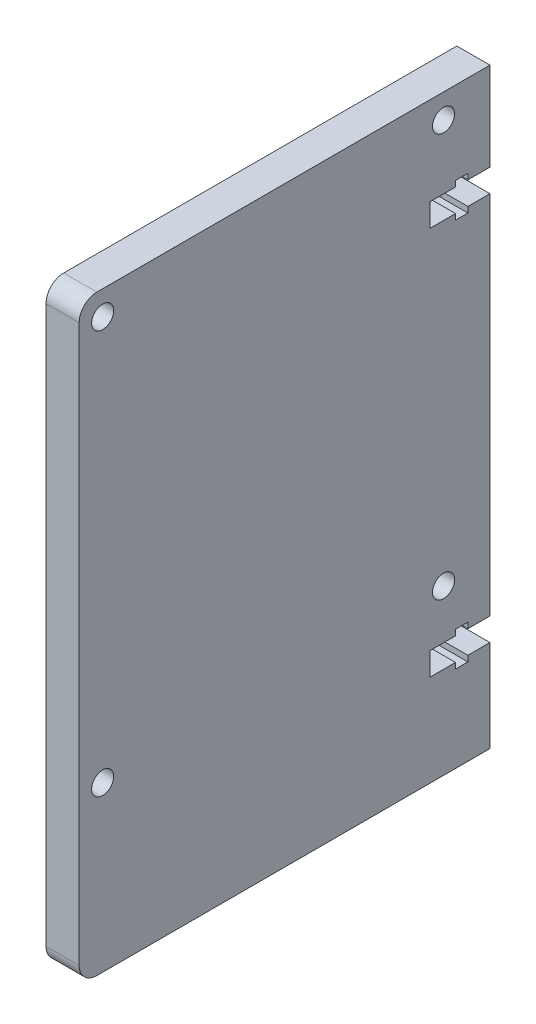
ISO-10303-21;
HEADER;
FILE_DESCRIPTION(('STEP AP214'),'2;1');
FILE_NAME('part.step','',(''),(''),'','','');
FILE_SCHEMA(('AUTOMOTIVE_DESIGN { 1 0 10303 214 1 1 1 1 }'));
ENDSEC;
DATA;
#1=APPLICATION_CONTEXT('core data for automotive mechanical design processes');
#2=APPLICATION_PROTOCOL_DEFINITION('international standard','automotive_design',2000,#1);
#3=PRODUCT_CONTEXT('',#1,'mechanical');
#4=PRODUCT('Part','Part','',(#3));
#5=PRODUCT_RELATED_PRODUCT_CATEGORY('part','',(#4));
#6=PRODUCT_DEFINITION_FORMATION('','',#4);
#7=PRODUCT_DEFINITION_CONTEXT('part definition',#1,'design');
#8=PRODUCT_DEFINITION('design','',#6,#7);
#9=PRODUCT_DEFINITION_SHAPE('','',#8);
#10=(LENGTH_UNIT() NAMED_UNIT(*) SI_UNIT(.MILLI.,.METRE.));
#11=(NAMED_UNIT(*) PLANE_ANGLE_UNIT() SI_UNIT($,.RADIAN.));
#12=(NAMED_UNIT(*) SI_UNIT($,.STERADIAN.) SOLID_ANGLE_UNIT());
#13=UNCERTAINTY_MEASURE_WITH_UNIT(LENGTH_MEASURE(1.E-05),#10,'distance_accuracy_value','');
#14=(GEOMETRIC_REPRESENTATION_CONTEXT(3) GLOBAL_UNCERTAINTY_ASSIGNED_CONTEXT((#13)) GLOBAL_UNIT_ASSIGNED_CONTEXT((#10,
#11,#12)) REPRESENTATION_CONTEXT('',''));
#15=CARTESIAN_POINT('',(0.,0.,0.));
#16=DIRECTION('',(0.,0.,1.));
#17=DIRECTION('',(1.,0.,0.));
#18=AXIS2_PLACEMENT_3D('',#15,#16,#17);
#19=CARTESIAN_POINT('',(4.7625,60.2720833333333,132.791435185185));
#20=DIRECTION('',(0.,0.,1.));
#21=DIRECTION('',(1.,0.,0.));
#22=AXIS2_PLACEMENT_3D('',#19,#20,#21);
#23=PLANE('',#22);
#24=DIRECTION('',(0.,1.,0.));
#25=VECTOR('',#24,1.);
#26=CARTESIAN_POINT('',(4.7625,60.2720833333333,132.791435185185));
#27=LINE('',#26,#25);
#28=CARTESIAN_POINT('',(4.7625,-8.30791666666669,132.791435185185));
#29=VERTEX_POINT('',#28);
#30=CARTESIAN_POINT('',(4.7625,44.2700833333333,132.791435185185));
#31=VERTEX_POINT('',#30);
#32=EDGE_CURVE('E267',#29,#31,#27,.T.);
#33=ORIENTED_EDGE('',*,*,#32,.F.);
#34=DIRECTION('',(-1.,0.,0.));
#35=VECTOR('',#34,1.);
#36=CARTESIAN_POINT('',(4.7625,-8.30791666666669,132.791435185185));
#37=LINE('',#36,#35);
#38=CARTESIAN_POINT('',(0.,-8.30791666666669,132.791435185185));
#39=VERTEX_POINT('',#38);
#40=EDGE_CURVE('E323',#29,#39,#37,.T.);
#41=ORIENTED_EDGE('',*,*,#40,.T.);
#42=DIRECTION('',(0.,1.,0.));
#43=VECTOR('',#42,1.);
#44=CARTESIAN_POINT('',(0.,60.2720833333333,132.791435185185));
#45=LINE('',#44,#43);
#46=CARTESIAN_POINT('',(0.,44.2700833333333,132.791435185185));
#47=VERTEX_POINT('',#46);
#48=EDGE_CURVE('E303',#39,#47,#45,.T.);
#49=ORIENTED_EDGE('',*,*,#48,.T.);
#50=DIRECTION('',(-1.,0.,0.));
#51=VECTOR('',#50,1.);
#52=CARTESIAN_POINT('',(4.7625,44.2700833333333,132.791435185185));
#53=LINE('',#52,#51);
#54=EDGE_CURVE('E378',#31,#47,#53,.T.);
#55=ORIENTED_EDGE('',*,*,#54,.F.);
#56=EDGE_LOOP('',(#33,#41,#49,#55));
#57=FACE_BOUND('',#56,.T.);
#58=ADVANCED_FACE('F39',(#57),#23,.F.);
#59=CARTESIAN_POINT('',(4.7625,47.5720833333333,132.791435185185));
#60=VERTEX_POINT('',#59);
#61=CARTESIAN_POINT('',(4.7625,60.2720833333333,132.791435185185));
#62=VERTEX_POINT('',#61);
#63=EDGE_CURVE('E269',#60,#62,#27,.T.);
#64=ORIENTED_EDGE('',*,*,#63,.F.);
#65=DIRECTION('',(-1.,0.,0.));
#66=VECTOR('',#65,1.);
#67=CARTESIAN_POINT('',(4.7625,47.5720833333333,132.791435185185));
#68=LINE('',#67,#66);
#69=CARTESIAN_POINT('',(0.,47.5720833333333,132.791435185185));
#70=VERTEX_POINT('',#69);
#71=EDGE_CURVE('E435',#60,#70,#68,.T.);
#72=ORIENTED_EDGE('',*,*,#71,.T.);
#73=CARTESIAN_POINT('',(0.,60.2720833333333,132.791435185185));
#74=VERTEX_POINT('',#73);
#75=EDGE_CURVE('E304',#70,#74,#45,.T.);
#76=ORIENTED_EDGE('',*,*,#75,.T.);
#77=DIRECTION('',(-1.,0.,0.));
#78=VECTOR('',#77,1.);
#79=CARTESIAN_POINT('',(4.7625,60.2720833333333,132.791435185185));
#80=LINE('',#79,#78);
#81=EDGE_CURVE('E997',#62,#74,#80,.T.);
#82=ORIENTED_EDGE('',*,*,#81,.F.);
#83=EDGE_LOOP('',(#64,#72,#76,#82));
#84=FACE_BOUND('',#83,.T.);
#85=ADVANCED_FACE('F587',(#84),#23,.F.);
#86=CARTESIAN_POINT('',(0.,-24.8179166666667,132.791435185185));
#87=VERTEX_POINT('',#86);
#88=CARTESIAN_POINT('',(0.,-11.6099166666667,132.791435185185));
#89=VERTEX_POINT('',#88);
#90=EDGE_CURVE('E258',#87,#89,#45,.T.);
#91=ORIENTED_EDGE('',*,*,#90,.T.);
#92=DIRECTION('',(-1.,0.,0.));
#93=VECTOR('',#92,1.);
#94=CARTESIAN_POINT('',(4.7625,-11.6099166666667,132.791435185185));
#95=LINE('',#94,#93);
#96=CARTESIAN_POINT('',(4.7625,-11.6099166666667,132.791435185185));
#97=VERTEX_POINT('',#96);
#98=EDGE_CURVE('E241',#97,#89,#95,.T.);
#99=ORIENTED_EDGE('',*,*,#98,.F.);
#100=CARTESIAN_POINT('',(4.7625,-24.8179166666667,132.791435185185));
#101=VERTEX_POINT('',#100);
#102=EDGE_CURVE('E256',#101,#97,#27,.T.);
#103=ORIENTED_EDGE('',*,*,#102,.F.);
#104=DIRECTION('',(-1.,0.,0.));
#105=VECTOR('',#104,1.);
#106=CARTESIAN_POINT('',(4.7625,-24.8179166666667,132.791435185185));
#107=LINE('',#106,#105);
#108=EDGE_CURVE('E291',#101,#87,#107,.T.);
#109=ORIENTED_EDGE('',*,*,#108,.T.);
#110=EDGE_LOOP('',(#91,#99,#103,#109));
#111=FACE_BOUND('',#110,.T.);
#112=ADVANCED_FACE('F254',(#111),#23,.F.);
#113=CARTESIAN_POINT('',(4.7625,60.2720833333333,191.846435185185));
#114=DIRECTION('',(0.,-1.,0.));
#115=DIRECTION('',(0.,0.,-1.));
#116=AXIS2_PLACEMENT_3D('',#113,#114,#115);
#117=PLANE('',#116);
#118=DIRECTION('',(0.,0.,1.));
#119=VECTOR('',#118,1.);
#120=CARTESIAN_POINT('',(0.,60.2720833333333,191.846435185185));
#121=LINE('',#120,#119);
#122=CARTESIAN_POINT('',(0.,60.2720833333333,189.306435185185));
#123=VERTEX_POINT('',#122);
#124=EDGE_CURVE('E285',#74,#123,#121,.T.);
#125=ORIENTED_EDGE('',*,*,#124,.T.);
#126=DIRECTION('',(-1.,0.,0.));
#127=VECTOR('',#126,1.);
#128=CARTESIAN_POINT('',(4.7625,60.2720833333333,189.306435185185));
#129=LINE('',#128,#127);
#130=CARTESIAN_POINT('',(4.7625,60.2720833333333,189.306435185185));
#131=VERTEX_POINT('',#130);
#132=EDGE_CURVE('E12',#123,#131,#129,.F.);
#133=ORIENTED_EDGE('',*,*,#132,.T.);
#134=DIRECTION('',(0.,0.,1.));
#135=VECTOR('',#134,1.);
#136=CARTESIAN_POINT('',(4.7625,60.2720833333333,191.846435185185));
#137=LINE('',#136,#135);
#138=EDGE_CURVE('E266',#62,#131,#137,.T.);
#139=ORIENTED_EDGE('',*,*,#138,.F.);
#140=ORIENTED_EDGE('',*,*,#81,.T.);
#141=EDGE_LOOP('',(#125,#133,#139,#140));
#142=FACE_BOUND('',#141,.T.);
#143=ADVANCED_FACE('F594',(#142),#117,.F.);
#144=CARTESIAN_POINT('',(4.7625,60.2720833333333,191.846435185185));
#145=DIRECTION('',(0.,0.,-1.));
#146=DIRECTION('',(-1.,0.,0.));
#147=AXIS2_PLACEMENT_3D('',#144,#145,#146);
#148=PLANE('',#147);
#149=DIRECTION('',(0.,-1.,0.));
#150=VECTOR('',#149,1.);
#151=CARTESIAN_POINT('',(0.,60.2720833333333,191.846435185185));
#152=LINE('',#151,#150);
#153=CARTESIAN_POINT('',(0.,57.7320833333333,191.846435185185));
#154=VERTEX_POINT('',#153);
#155=CARTESIAN_POINT('',(0.,-22.2779166666667,191.846435185185));
#156=VERTEX_POINT('',#155);
#157=EDGE_CURVE('E277',#154,#156,#152,.T.);
#158=ORIENTED_EDGE('',*,*,#157,.T.);
#159=DIRECTION('',(-1.,0.,0.));
#160=VECTOR('',#159,1.);
#161=CARTESIAN_POINT('',(4.7625,-22.2779166666667,191.846435185185));
#162=LINE('',#161,#160);
#163=CARTESIAN_POINT('',(4.7625,-22.2779166666667,191.846435185185));
#164=VERTEX_POINT('',#163);
#165=EDGE_CURVE('E60',#156,#164,#162,.F.);
#166=ORIENTED_EDGE('',*,*,#165,.T.);
#167=DIRECTION('',(0.,-1.,0.));
#168=VECTOR('',#167,1.);
#169=CARTESIAN_POINT('',(4.7625,60.2720833333333,191.846435185185));
#170=LINE('',#169,#168);
#171=CARTESIAN_POINT('',(4.7625,57.7320833333333,191.846435185185));
#172=VERTEX_POINT('',#171);
#173=EDGE_CURVE('E270',#172,#164,#170,.T.);
#174=ORIENTED_EDGE('',*,*,#173,.F.);
#175=DIRECTION('',(-1.,0.,0.));
#176=VECTOR('',#175,1.);
#177=CARTESIAN_POINT('',(4.7625,57.7320833333333,191.846435185185));
#178=LINE('',#177,#176);
#179=EDGE_CURVE('E986',#172,#154,#178,.T.);
#180=ORIENTED_EDGE('',*,*,#179,.T.);
#181=EDGE_LOOP('',(#158,#166,#174,#180));
#182=FACE_BOUND('',#181,.T.);
#183=ADVANCED_FACE('F598',(#182),#148,.F.);
#184=CARTESIAN_POINT('',(4.7625,-24.8179166666667,191.846435185185));
#185=DIRECTION('',(0.,1.,0.));
#186=DIRECTION('',(0.,0.,1.));
#187=AXIS2_PLACEMENT_3D('',#184,#185,#186);
#188=PLANE('',#187);
#189=DIRECTION('',(0.,0.,-1.));
#190=VECTOR('',#189,1.);
#191=CARTESIAN_POINT('',(4.7625,-24.8179166666667,191.846435185185));
#192=LINE('',#191,#190);
#193=CARTESIAN_POINT('',(4.7625,-24.8179166666667,189.306435185185));
#194=VERTEX_POINT('',#193);
#195=EDGE_CURVE('E264',#194,#101,#192,.T.);
#196=ORIENTED_EDGE('',*,*,#195,.F.);
#197=DIRECTION('',(-1.,0.,0.));
#198=VECTOR('',#197,1.);
#199=CARTESIAN_POINT('',(4.7625,-24.8179166666667,189.306435185185));
#200=LINE('',#199,#198);
#201=CARTESIAN_POINT('',(0.,-24.8179166666667,189.306435185185));
#202=VERTEX_POINT('',#201);
#203=EDGE_CURVE('E996',#194,#202,#200,.T.);
#204=ORIENTED_EDGE('',*,*,#203,.T.);
#205=DIRECTION('',(0.,0.,-1.));
#206=VECTOR('',#205,1.);
#207=CARTESIAN_POINT('',(0.,-24.8179166666667,191.846435185185));
#208=LINE('',#207,#206);
#209=EDGE_CURVE('E273',#202,#87,#208,.T.);
#210=ORIENTED_EDGE('',*,*,#209,.T.);
#211=ORIENTED_EDGE('',*,*,#108,.F.);
#212=EDGE_LOOP('',(#196,#204,#210,#211));
#213=FACE_BOUND('',#212,.T.);
#214=ADVANCED_FACE('F602',(#213),#188,.F.);
#215=CARTESIAN_POINT('',(4.7625,0.,0.));
#216=DIRECTION('',(1.,0.,0.));
#217=DIRECTION('',(0.,0.,-1.));
#218=AXIS2_PLACEMENT_3D('',#215,#216,#217);
#219=PLANE('',#218);
#220=ORIENTED_EDGE('',*,*,#173,.T.);
#221=CARTESIAN_POINT('',(4.7625,-22.2779166666667,189.306435185185));
#222=DIRECTION('',(1.,0.,0.));
#223=DIRECTION('',(0.,0.,-1.));
#224=AXIS2_PLACEMENT_3D('',#221,#222,#223);
#225=CIRCLE('',#224,2.54);
#226=EDGE_CURVE('E47',#164,#194,#225,.T.);
#227=ORIENTED_EDGE('',*,*,#226,.T.);
#228=ORIENTED_EDGE('',*,*,#195,.T.);
#229=ORIENTED_EDGE('',*,*,#102,.T.);
#230=DIRECTION('',(0.,0.,1.));
#231=VECTOR('',#230,1.);
#232=CARTESIAN_POINT('',(4.7625,-11.6099166666667,132.791435185185));
#233=LINE('',#232,#231);
#234=CARTESIAN_POINT('',(4.7625,-11.6099166666667,135.966435185185));
#235=VERTEX_POINT('',#234);
#236=EDGE_CURVE('E237',#97,#235,#233,.T.);
#237=ORIENTED_EDGE('',*,*,#236,.T.);
#238=DIRECTION('',(0.,-1.,0.));
#239=VECTOR('',#238,1.);
#240=CARTESIAN_POINT('',(4.7625,-12.4354166666667,135.966435185185));
#241=LINE('',#240,#239);
#242=CARTESIAN_POINT('',(4.7625,-12.4354166666667,135.966435185185));
#243=VERTEX_POINT('',#242);
#244=EDGE_CURVE('E248',#235,#243,#241,.T.);
#245=ORIENTED_EDGE('',*,*,#244,.T.);
#246=DIRECTION('',(0.,0.,1.));
#247=VECTOR('',#246,1.);
#248=CARTESIAN_POINT('',(4.7625,-12.4354166666667,135.966435185185));
#249=LINE('',#248,#247);
#250=CARTESIAN_POINT('',(4.7625,-12.4354166666667,137.744435185185));
#251=VERTEX_POINT('',#250);
#252=EDGE_CURVE('E1034',#243,#251,#249,.T.);
#253=ORIENTED_EDGE('',*,*,#252,.T.);
#254=DIRECTION('',(0.,1.,0.));
#255=VECTOR('',#254,1.);
#256=CARTESIAN_POINT('',(4.7625,-12.4354166666667,137.744435185185));
#257=LINE('',#256,#255);
#258=CARTESIAN_POINT('',(4.7625,-11.6099166666667,137.744435185185));
#259=VERTEX_POINT('',#258);
#260=EDGE_CURVE('E1028',#251,#259,#257,.T.);
#261=ORIENTED_EDGE('',*,*,#260,.T.);
#262=DIRECTION('',(0.,0.,1.));
#263=VECTOR('',#262,1.);
#264=CARTESIAN_POINT('',(4.7625,-11.6099166666667,137.744435185185));
#265=LINE('',#264,#263);
#266=CARTESIAN_POINT('',(4.7625,-11.6099166666667,141.427435185185));
#267=VERTEX_POINT('',#266);
#268=EDGE_CURVE('E1026',#259,#267,#265,.T.);
#269=ORIENTED_EDGE('',*,*,#268,.T.);
#270=DIRECTION('',(0.,1.,0.));
#271=VECTOR('',#270,1.);
#272=CARTESIAN_POINT('',(4.7625,-8.30791666666669,141.427435185185));
#273=LINE('',#272,#271);
#274=CARTESIAN_POINT('',(4.7625,-8.30791666666669,141.427435185185));
#275=VERTEX_POINT('',#274);
#276=EDGE_CURVE('E1021',#267,#275,#273,.T.);
#277=ORIENTED_EDGE('',*,*,#276,.T.);
#278=DIRECTION('',(0.,0.,-1.));
#279=VECTOR('',#278,1.);
#280=CARTESIAN_POINT('',(4.7625,-8.30791666666669,137.744435185185));
#281=LINE('',#280,#279);
#282=CARTESIAN_POINT('',(4.7625,-8.30791666666669,137.744435185185));
#283=VERTEX_POINT('',#282);
#284=EDGE_CURVE('E1017',#275,#283,#281,.T.);
#285=ORIENTED_EDGE('',*,*,#284,.T.);
#286=DIRECTION('',(0.,1.,0.));
#287=VECTOR('',#286,1.);
#288=CARTESIAN_POINT('',(4.7625,-8.30791666666669,137.744435185185));
#289=LINE('',#288,#287);
#290=CARTESIAN_POINT('',(4.7625,-7.48241666666668,137.744435185185));
#291=VERTEX_POINT('',#290);
#292=EDGE_CURVE('E1020',#283,#291,#289,.T.);
#293=ORIENTED_EDGE('',*,*,#292,.T.);
#294=DIRECTION('',(0.,0.,-1.));
#295=VECTOR('',#294,1.);
#296=CARTESIAN_POINT('',(4.7625,-7.48241666666668,135.966435185185));
#297=LINE('',#296,#295);
#298=CARTESIAN_POINT('',(4.7625,-7.48241666666668,135.966435185185));
#299=VERTEX_POINT('',#298);
#300=EDGE_CURVE('E520',#291,#299,#297,.T.);
#301=ORIENTED_EDGE('',*,*,#300,.T.);
#302=DIRECTION('',(0.,-1.,0.));
#303=VECTOR('',#302,1.);
#304=CARTESIAN_POINT('',(4.7625,-8.30791666666669,135.966435185185));
#305=LINE('',#304,#303);
#306=CARTESIAN_POINT('',(4.7625,-8.30791666666669,135.966435185185));
#307=VERTEX_POINT('',#306);
#308=EDGE_CURVE('E517',#299,#307,#305,.T.);
#309=ORIENTED_EDGE('',*,*,#308,.T.);
#310=DIRECTION('',(0.,0.,-1.));
#311=VECTOR('',#310,1.);
#312=CARTESIAN_POINT('',(4.7625,-8.30791666666669,132.791435185185));
#313=LINE('',#312,#311);
#314=EDGE_CURVE('E259',#307,#29,#313,.T.);
#315=ORIENTED_EDGE('',*,*,#314,.T.);
#316=ORIENTED_EDGE('',*,*,#32,.T.);
#317=DIRECTION('',(0.,0.,1.));
#318=VECTOR('',#317,1.);
#319=CARTESIAN_POINT('',(4.7625,44.2700833333333,132.791435185185));
#320=LINE('',#319,#318);
#321=CARTESIAN_POINT('',(4.7625,44.2700833333333,135.966435185185));
#322=VERTEX_POINT('',#321);
#323=EDGE_CURVE('E346',#31,#322,#320,.T.);
#324=ORIENTED_EDGE('',*,*,#323,.T.);
#325=DIRECTION('',(0.,-1.,0.));
#326=VECTOR('',#325,1.);
#327=CARTESIAN_POINT('',(4.7625,43.4445833333333,135.966435185185));
#328=LINE('',#327,#326);
#329=CARTESIAN_POINT('',(4.7625,43.4445833333333,135.966435185185));
#330=VERTEX_POINT('',#329);
#331=EDGE_CURVE('E349',#322,#330,#328,.T.);
#332=ORIENTED_EDGE('',*,*,#331,.T.);
#333=DIRECTION('',(0.,0.,1.));
#334=VECTOR('',#333,1.);
#335=CARTESIAN_POINT('',(4.7625,43.4445833333333,135.966435185185));
#336=LINE('',#335,#334);
#337=CARTESIAN_POINT('',(4.7625,43.4445833333333,137.744435185185));
#338=VERTEX_POINT('',#337);
#339=EDGE_CURVE('E353',#330,#338,#336,.T.);
#340=ORIENTED_EDGE('',*,*,#339,.T.);
#341=DIRECTION('',(0.,1.,0.));
#342=VECTOR('',#341,1.);
#343=CARTESIAN_POINT('',(4.7625,43.4445833333333,137.744435185185));
#344=LINE('',#343,#342);
#345=CARTESIAN_POINT('',(4.7625,44.2700833333333,137.744435185185));
#346=VERTEX_POINT('',#345);
#347=EDGE_CURVE('E356',#338,#346,#344,.T.);
#348=ORIENTED_EDGE('',*,*,#347,.T.);
#349=DIRECTION('',(0.,0.,1.));
#350=VECTOR('',#349,1.);
#351=CARTESIAN_POINT('',(4.7625,44.2700833333333,137.744435185185));
#352=LINE('',#351,#350);
#353=CARTESIAN_POINT('',(4.7625,44.2700833333333,141.427435185185));
#354=VERTEX_POINT('',#353);
#355=EDGE_CURVE('E359',#346,#354,#352,.T.);
#356=ORIENTED_EDGE('',*,*,#355,.T.);
#357=DIRECTION('',(0.,1.,0.));
#358=VECTOR('',#357,1.);
#359=CARTESIAN_POINT('',(4.7625,47.5720833333333,141.427435185185));
#360=LINE('',#359,#358);
#361=CARTESIAN_POINT('',(4.7625,47.5720833333333,141.427435185185));
#362=VERTEX_POINT('',#361);
#363=EDGE_CURVE('E362',#354,#362,#360,.T.);
#364=ORIENTED_EDGE('',*,*,#363,.T.);
#365=DIRECTION('',(0.,0.,-1.));
#366=VECTOR('',#365,1.);
#367=CARTESIAN_POINT('',(4.7625,47.5720833333333,137.744435185185));
#368=LINE('',#367,#366);
#369=CARTESIAN_POINT('',(4.7625,47.5720833333333,137.744435185185));
#370=VERTEX_POINT('',#369);
#371=EDGE_CURVE('E365',#362,#370,#368,.T.);
#372=ORIENTED_EDGE('',*,*,#371,.T.);
#373=DIRECTION('',(0.,1.,0.));
#374=VECTOR('',#373,1.);
#375=CARTESIAN_POINT('',(4.7625,47.5720833333333,137.744435185185));
#376=LINE('',#375,#374);
#377=CARTESIAN_POINT('',(4.7625,48.3975833333333,137.744435185185));
#378=VERTEX_POINT('',#377);
#379=EDGE_CURVE('E368',#370,#378,#376,.T.);
#380=ORIENTED_EDGE('',*,*,#379,.T.);
#381=DIRECTION('',(0.,0.,-1.));
#382=VECTOR('',#381,1.);
#383=CARTESIAN_POINT('',(4.7625,48.3975833333333,135.966435185185));
#384=LINE('',#383,#382);
#385=CARTESIAN_POINT('',(4.7625,48.3975833333333,135.966435185185));
#386=VERTEX_POINT('',#385);
#387=EDGE_CURVE('E371',#378,#386,#384,.T.);
#388=ORIENTED_EDGE('',*,*,#387,.T.);
#389=DIRECTION('',(0.,-1.,0.));
#390=VECTOR('',#389,1.);
#391=CARTESIAN_POINT('',(4.7625,47.5720833333333,135.966435185185));
#392=LINE('',#391,#390);
#393=CARTESIAN_POINT('',(4.7625,47.5720833333333,135.966435185185));
#394=VERTEX_POINT('',#393);
#395=EDGE_CURVE('E374',#386,#394,#392,.T.);
#396=ORIENTED_EDGE('',*,*,#395,.T.);
#397=DIRECTION('',(0.,0.,-1.));
#398=VECTOR('',#397,1.);
#399=CARTESIAN_POINT('',(4.7625,47.5720833333333,132.791435185185));
#400=LINE('',#399,#398);
#401=EDGE_CURVE('E377',#394,#60,#400,.T.);
#402=ORIENTED_EDGE('',*,*,#401,.T.);
#403=ORIENTED_EDGE('',*,*,#63,.T.);
#404=ORIENTED_EDGE('',*,*,#138,.T.);
#405=CARTESIAN_POINT('',(4.7625,57.7320833333333,189.306435185185));
#406=DIRECTION('',(1.,0.,0.));
#407=DIRECTION('',(0.,0.,-1.));
#408=AXIS2_PLACEMENT_3D('',#405,#406,#407);
#409=CIRCLE('',#408,2.54);
#410=EDGE_CURVE('E984',#131,#172,#409,.T.);
#411=ORIENTED_EDGE('',*,*,#410,.T.);
#412=EDGE_LOOP('',(#220,#227,#228,#229,#237,#245,#253,#261,#269,#277,#285,#293,#301,#309,#315,
#316,#324,#332,#340,#348,#356,#364,#372,#380,#388,#396,#402,#403,#404,#411));
#413=FACE_BOUND('',#412,.T.);
#414=CARTESIAN_POINT('',(4.7625,-1.22791666666672,139.466435185185));
#415=DIRECTION('',(1.,0.,0.));
#416=DIRECTION('',(0.,0.,-1.));
#417=AXIS2_PLACEMENT_3D('',#414,#415,#416);
#418=CIRCLE('',#417,1.58749999999999);
#419=CARTESIAN_POINT('',(4.7625,-1.22791666666672,137.878935185185));
#420=VERTEX_POINT('',#419);
#421=EDGE_CURVE('E461',#420,#420,#418,.T.);
#422=ORIENTED_EDGE('',*,*,#421,.F.);
#423=EDGE_LOOP('',(#422));
#424=FACE_BOUND('',#423,.T.);
#425=CARTESIAN_POINT('',(4.7625,56.7720833333333,139.466435185185));
#426=DIRECTION('',(1.,0.,0.));
#427=DIRECTION('',(0.,0.,-1.));
#428=AXIS2_PLACEMENT_3D('',#425,#426,#427);
#429=CIRCLE('',#428,1.58749999999999);
#430=CARTESIAN_POINT('',(4.7625,56.7720833333333,137.878935185185));
#431=VERTEX_POINT('',#430);
#432=EDGE_CURVE('E470',#431,#431,#429,.T.);
#433=ORIENTED_EDGE('',*,*,#432,.F.);
#434=EDGE_LOOP('',(#433));
#435=FACE_BOUND('',#434,.T.);
#436=CARTESIAN_POINT('',(4.7625,56.7720833333333,188.466435185185));
#437=DIRECTION('',(1.,0.,0.));
#438=DIRECTION('',(0.,0.,-1.));
#439=AXIS2_PLACEMENT_3D('',#436,#437,#438);
#440=CIRCLE('',#439,1.58749999999999);
#441=CARTESIAN_POINT('',(4.7625,56.7720833333333,186.878935185185));
#442=VERTEX_POINT('',#441);
#443=EDGE_CURVE('E438',#442,#442,#440,.T.);
#444=ORIENTED_EDGE('',*,*,#443,.F.);
#445=EDGE_LOOP('',(#444));
#446=FACE_BOUND('',#445,.T.);
#447=CARTESIAN_POINT('',(4.7625,-1.22791666666672,188.466435185185));
#448=DIRECTION('',(1.,0.,0.));
#449=DIRECTION('',(0.,0.,-1.));
#450=AXIS2_PLACEMENT_3D('',#447,#448,#449);
#451=CIRCLE('',#450,1.58749999999999);
#452=CARTESIAN_POINT('',(4.7625,-1.22791666666672,186.878935185185));
#453=VERTEX_POINT('',#452);
#454=EDGE_CURVE('E469',#453,#453,#451,.T.);
#455=ORIENTED_EDGE('',*,*,#454,.F.);
#456=EDGE_LOOP('',(#455));
#457=FACE_BOUND('',#456,.T.);
#458=ADVANCED_FACE('F261',(#413,#424,#435,#446,#457),#219,.T.);
#459=CARTESIAN_POINT('',(0.,0.,0.));
#460=DIRECTION('',(1.,0.,0.));
#461=DIRECTION('',(0.,0.,-1.));
#462=AXIS2_PLACEMENT_3D('',#459,#460,#461);
#463=PLANE('',#462);
#464=CARTESIAN_POINT('',(0.,-1.22791666666672,139.466435185185));
#465=DIRECTION('',(1.,0.,0.));
#466=DIRECTION('',(0.,0.,-1.));
#467=AXIS2_PLACEMENT_3D('',#464,#465,#466);
#468=CIRCLE('',#467,1.58749999999999);
#469=CARTESIAN_POINT('',(0.,-1.22791666666672,137.878935185185));
#470=VERTEX_POINT('',#469);
#471=EDGE_CURVE('E464',#470,#470,#468,.F.);
#472=ORIENTED_EDGE('',*,*,#471,.F.);
#473=EDGE_LOOP('',(#472));
#474=FACE_BOUND('',#473,.T.);
#475=CARTESIAN_POINT('',(0.,56.7720833333333,139.466435185185));
#476=DIRECTION('',(1.,0.,0.));
#477=DIRECTION('',(0.,0.,-1.));
#478=AXIS2_PLACEMENT_3D('',#475,#476,#477);
#479=CIRCLE('',#478,1.58749999999999);
#480=CARTESIAN_POINT('',(0.,56.7720833333333,137.878935185185));
#481=VERTEX_POINT('',#480);
#482=EDGE_CURVE('E465',#481,#481,#479,.F.);
#483=ORIENTED_EDGE('',*,*,#482,.F.);
#484=EDGE_LOOP('',(#483));
#485=FACE_BOUND('',#484,.T.);
#486=CARTESIAN_POINT('',(0.,56.7720833333333,188.466435185185));
#487=DIRECTION('',(1.,0.,0.));
#488=DIRECTION('',(0.,0.,-1.));
#489=AXIS2_PLACEMENT_3D('',#486,#487,#488);
#490=CIRCLE('',#489,1.58749999999999);
#491=CARTESIAN_POINT('',(0.,56.7720833333333,186.878935185185));
#492=VERTEX_POINT('',#491);
#493=EDGE_CURVE('E473',#492,#492,#490,.F.);
#494=ORIENTED_EDGE('',*,*,#493,.F.);
#495=EDGE_LOOP('',(#494));
#496=FACE_BOUND('',#495,.T.);
#497=CARTESIAN_POINT('',(0.,-1.22791666666672,188.466435185185));
#498=DIRECTION('',(1.,0.,0.));
#499=DIRECTION('',(0.,0.,-1.));
#500=AXIS2_PLACEMENT_3D('',#497,#498,#499);
#501=CIRCLE('',#500,1.58749999999999);
#502=CARTESIAN_POINT('',(0.,-1.22791666666672,186.878935185185));
#503=VERTEX_POINT('',#502);
#504=EDGE_CURVE('E483',#503,#503,#501,.F.);
#505=ORIENTED_EDGE('',*,*,#504,.F.);
#506=EDGE_LOOP('',(#505));
#507=FACE_BOUND('',#506,.T.);
#508=ORIENTED_EDGE('',*,*,#209,.F.);
#509=CARTESIAN_POINT('',(0.,-22.2779166666667,189.306435185185));
#510=DIRECTION('',(1.,0.,0.));
#511=DIRECTION('',(0.,0.,-1.));
#512=AXIS2_PLACEMENT_3D('',#509,#510,#511);
#513=CIRCLE('',#512,2.54);
#514=EDGE_CURVE('E991',#202,#156,#513,.F.);
#515=ORIENTED_EDGE('',*,*,#514,.T.);
#516=ORIENTED_EDGE('',*,*,#157,.F.);
#517=CARTESIAN_POINT('',(0.,57.7320833333333,189.306435185185));
#518=DIRECTION('',(1.,0.,0.));
#519=DIRECTION('',(0.,0.,-1.));
#520=AXIS2_PLACEMENT_3D('',#517,#518,#519);
#521=CIRCLE('',#520,2.54);
#522=EDGE_CURVE('E993',#154,#123,#521,.F.);
#523=ORIENTED_EDGE('',*,*,#522,.T.);
#524=ORIENTED_EDGE('',*,*,#124,.F.);
#525=ORIENTED_EDGE('',*,*,#75,.F.);
#526=DIRECTION('',(0.,0.,-1.));
#527=VECTOR('',#526,1.);
#528=CARTESIAN_POINT('',(0.,47.5720833333333,132.791435185185));
#529=LINE('',#528,#527);
#530=CARTESIAN_POINT('',(0.,47.5720833333333,135.966435185185));
#531=VERTEX_POINT('',#530);
#532=EDGE_CURVE('E350',#531,#70,#529,.T.);
#533=ORIENTED_EDGE('',*,*,#532,.F.);
#534=DIRECTION('',(0.,-1.,0.));
#535=VECTOR('',#534,1.);
#536=CARTESIAN_POINT('',(0.,47.5720833333333,135.966435185185));
#537=LINE('',#536,#535);
#538=CARTESIAN_POINT('',(0.,48.3975833333333,135.966435185185));
#539=VERTEX_POINT('',#538);
#540=EDGE_CURVE('E427',#539,#531,#537,.T.);
#541=ORIENTED_EDGE('',*,*,#540,.F.);
#542=DIRECTION('',(0.,0.,-1.));
#543=VECTOR('',#542,1.);
#544=CARTESIAN_POINT('',(0.,48.3975833333333,135.966435185185));
#545=LINE('',#544,#543);
#546=CARTESIAN_POINT('',(0.,48.3975833333333,137.744435185185));
#547=VERTEX_POINT('',#546);
#548=EDGE_CURVE('E422',#547,#539,#545,.T.);
#549=ORIENTED_EDGE('',*,*,#548,.F.);
#550=DIRECTION('',(0.,1.,0.));
#551=VECTOR('',#550,1.);
#552=CARTESIAN_POINT('',(0.,47.5720833333333,137.744435185185));
#553=LINE('',#552,#551);
#554=CARTESIAN_POINT('',(0.,47.5720833333333,137.744435185185));
#555=VERTEX_POINT('',#554);
#556=EDGE_CURVE('E418',#555,#547,#553,.T.);
#557=ORIENTED_EDGE('',*,*,#556,.F.);
#558=DIRECTION('',(0.,0.,-1.));
#559=VECTOR('',#558,1.);
#560=CARTESIAN_POINT('',(0.,47.5720833333333,137.744435185185));
#561=LINE('',#560,#559);
#562=CARTESIAN_POINT('',(0.,47.5720833333333,141.427435185185));
#563=VERTEX_POINT('',#562);
#564=EDGE_CURVE('E410',#563,#555,#561,.T.);
#565=ORIENTED_EDGE('',*,*,#564,.F.);
#566=DIRECTION('',(0.,1.,0.));
#567=VECTOR('',#566,1.);
#568=CARTESIAN_POINT('',(0.,47.5720833333333,141.427435185185));
#569=LINE('',#568,#567);
#570=CARTESIAN_POINT('',(0.,44.2700833333333,141.427435185185));
#571=VERTEX_POINT('',#570);
#572=EDGE_CURVE('E405',#571,#563,#569,.T.);
#573=ORIENTED_EDGE('',*,*,#572,.F.);
#574=DIRECTION('',(0.,0.,1.));
#575=VECTOR('',#574,1.);
#576=CARTESIAN_POINT('',(0.,44.2700833333333,137.744435185185));
#577=LINE('',#576,#575);
#578=CARTESIAN_POINT('',(0.,44.2700833333333,137.744435185185));
#579=VERTEX_POINT('',#578);
#580=EDGE_CURVE('E400',#579,#571,#577,.T.);
#581=ORIENTED_EDGE('',*,*,#580,.F.);
#582=DIRECTION('',(0.,1.,0.));
#583=VECTOR('',#582,1.);
#584=CARTESIAN_POINT('',(0.,43.4445833333333,137.744435185185));
#585=LINE('',#584,#583);
#586=CARTESIAN_POINT('',(0.,43.4445833333333,137.744435185185));
#587=VERTEX_POINT('',#586);
#588=EDGE_CURVE('E396',#587,#579,#585,.T.);
#589=ORIENTED_EDGE('',*,*,#588,.F.);
#590=DIRECTION('',(0.,0.,1.));
#591=VECTOR('',#590,1.);
#592=CARTESIAN_POINT('',(0.,43.4445833333333,135.966435185185));
#593=LINE('',#592,#591);
#594=CARTESIAN_POINT('',(0.,43.4445833333333,135.966435185185));
#595=VERTEX_POINT('',#594);
#596=EDGE_CURVE('E388',#595,#587,#593,.T.);
#597=ORIENTED_EDGE('',*,*,#596,.F.);
#598=DIRECTION('',(0.,-1.,0.));
#599=VECTOR('',#598,1.);
#600=CARTESIAN_POINT('',(0.,43.4445833333333,135.966435185185));
#601=LINE('',#600,#599);
#602=CARTESIAN_POINT('',(0.,44.2700833333333,135.966435185185));
#603=VERTEX_POINT('',#602);
#604=EDGE_CURVE('E383',#603,#595,#601,.T.);
#605=ORIENTED_EDGE('',*,*,#604,.F.);
#606=DIRECTION('',(0.,0.,1.));
#607=VECTOR('',#606,1.);
#608=CARTESIAN_POINT('',(0.,44.2700833333333,132.791435185185));
#609=LINE('',#608,#607);
#610=EDGE_CURVE('E326',#47,#603,#609,.T.);
#611=ORIENTED_EDGE('',*,*,#610,.F.);
#612=ORIENTED_EDGE('',*,*,#48,.F.);
#613=DIRECTION('',(0.,0.,-1.));
#614=VECTOR('',#613,1.);
#615=CARTESIAN_POINT('',(0.,-8.30791666666669,132.791435185185));
#616=LINE('',#615,#614);
#617=CARTESIAN_POINT('',(0.,-8.30791666666669,135.966435185185));
#618=VERTEX_POINT('',#617);
#619=EDGE_CURVE('E249',#618,#39,#616,.T.);
#620=ORIENTED_EDGE('',*,*,#619,.F.);
#621=DIRECTION('',(0.,-1.,0.));
#622=VECTOR('',#621,1.);
#623=CARTESIAN_POINT('',(0.,-8.30791666666669,135.966435185185));
#624=LINE('',#623,#622);
#625=CARTESIAN_POINT('',(0.,-7.48241666666668,135.966435185185));
#626=VERTEX_POINT('',#625);
#627=EDGE_CURVE('E320',#626,#618,#624,.T.);
#628=ORIENTED_EDGE('',*,*,#627,.F.);
#629=DIRECTION('',(0.,0.,-1.));
#630=VECTOR('',#629,1.);
#631=CARTESIAN_POINT('',(0.,-7.48241666666668,135.966435185185));
#632=LINE('',#631,#630);
#633=CARTESIAN_POINT('',(0.,-7.48241666666668,137.744435185185));
#634=VERTEX_POINT('',#633);
#635=EDGE_CURVE('E565',#634,#626,#632,.T.);
#636=ORIENTED_EDGE('',*,*,#635,.F.);
#637=DIRECTION('',(0.,1.,0.));
#638=VECTOR('',#637,1.);
#639=CARTESIAN_POINT('',(0.,-8.30791666666669,137.744435185185));
#640=LINE('',#639,#638);
#641=CARTESIAN_POINT('',(0.,-8.30791666666669,137.744435185185));
#642=VERTEX_POINT('',#641);
#643=EDGE_CURVE('E561',#642,#634,#640,.T.);
#644=ORIENTED_EDGE('',*,*,#643,.F.);
#645=DIRECTION('',(0.,0.,-1.));
#646=VECTOR('',#645,1.);
#647=CARTESIAN_POINT('',(0.,-8.30791666666669,137.744435185185));
#648=LINE('',#647,#646);
#649=CARTESIAN_POINT('',(0.,-8.30791666666669,141.427435185185));
#650=VERTEX_POINT('',#649);
#651=EDGE_CURVE('E557',#650,#642,#648,.T.);
#652=ORIENTED_EDGE('',*,*,#651,.F.);
#653=DIRECTION('',(0.,1.,0.));
#654=VECTOR('',#653,1.);
#655=CARTESIAN_POINT('',(0.,-8.30791666666669,141.427435185185));
#656=LINE('',#655,#654);
#657=CARTESIAN_POINT('',(0.,-11.6099166666667,141.427435185185));
#658=VERTEX_POINT('',#657);
#659=EDGE_CURVE('E550',#658,#650,#656,.T.);
#660=ORIENTED_EDGE('',*,*,#659,.F.);
#661=DIRECTION('',(0.,0.,1.));
#662=VECTOR('',#661,1.);
#663=CARTESIAN_POINT('',(0.,-11.6099166666667,137.744435185185));
#664=LINE('',#663,#662);
#665=CARTESIAN_POINT('',(0.,-11.6099166666667,137.744435185185));
#666=VERTEX_POINT('',#665);
#667=EDGE_CURVE('E545',#666,#658,#664,.T.);
#668=ORIENTED_EDGE('',*,*,#667,.F.);
#669=DIRECTION('',(0.,1.,0.));
#670=VECTOR('',#669,1.);
#671=CARTESIAN_POINT('',(0.,-12.4354166666667,137.744435185185));
#672=LINE('',#671,#670);
#673=CARTESIAN_POINT('',(0.,-12.4354166666667,137.744435185185));
#674=VERTEX_POINT('',#673);
#675=EDGE_CURVE('E540',#674,#666,#672,.T.);
#676=ORIENTED_EDGE('',*,*,#675,.F.);
#677=DIRECTION('',(0.,0.,1.));
#678=VECTOR('',#677,1.);
#679=CARTESIAN_POINT('',(0.,-12.4354166666667,135.966435185185));
#680=LINE('',#679,#678);
#681=CARTESIAN_POINT('',(0.,-12.4354166666667,135.966435185185));
#682=VERTEX_POINT('',#681);
#683=EDGE_CURVE('E536',#682,#674,#680,.T.);
#684=ORIENTED_EDGE('',*,*,#683,.F.);
#685=DIRECTION('',(0.,-1.,0.));
#686=VECTOR('',#685,1.);
#687=CARTESIAN_POINT('',(0.,-12.4354166666667,135.966435185185));
#688=LINE('',#687,#686);
#689=CARTESIAN_POINT('',(0.,-11.6099166666667,135.966435185185));
#690=VERTEX_POINT('',#689);
#691=EDGE_CURVE('E528',#690,#682,#688,.T.);
#692=ORIENTED_EDGE('',*,*,#691,.F.);
#693=DIRECTION('',(0.,0.,1.));
#694=VECTOR('',#693,1.);
#695=CARTESIAN_POINT('',(0.,-11.6099166666667,132.791435185185));
#696=LINE('',#695,#694);
#697=EDGE_CURVE('E524',#89,#690,#696,.T.);
#698=ORIENTED_EDGE('',*,*,#697,.F.);
#699=ORIENTED_EDGE('',*,*,#90,.F.);
#700=EDGE_LOOP('',(#508,#515,#516,#523,#524,#525,#533,#541,#549,#557,#565,#573,#581,#589,#597,
#605,#611,#612,#620,#628,#636,#644,#652,#660,#668,#676,#684,#692,#698,#699));
#701=FACE_BOUND('',#700,.T.);
#702=ADVANCED_FACE('F504',(#474,#485,#496,#507,#701),#463,.F.);
#703=CARTESIAN_POINT('',(-0.00100000000000013,-1.22791666666672,188.466435185185));
#704=DIRECTION('',(1.,0.,0.));
#705=DIRECTION('',(0.,0.,-1.));
#706=AXIS2_PLACEMENT_3D('',#703,#704,#705);
#707=CYLINDRICAL_SURFACE('',#706,1.58749999999999);
#708=ORIENTED_EDGE('',*,*,#454,.T.);
#709=EDGE_LOOP('',(#708));
#710=FACE_BOUND('',#709,.T.);
#711=ORIENTED_EDGE('',*,*,#504,.T.);
#712=EDGE_LOOP('',(#711));
#713=FACE_BOUND('',#712,.T.);
#714=ADVANCED_FACE('F609',(#710,#713),#707,.F.);
#715=CARTESIAN_POINT('',(-0.00100000000000013,56.7720833333333,188.466435185185));
#716=DIRECTION('',(1.,0.,0.));
#717=DIRECTION('',(0.,0.,-1.));
#718=AXIS2_PLACEMENT_3D('',#715,#716,#717);
#719=CYLINDRICAL_SURFACE('',#718,1.58749999999999);
#720=ORIENTED_EDGE('',*,*,#443,.T.);
#721=EDGE_LOOP('',(#720));
#722=FACE_BOUND('',#721,.T.);
#723=ORIENTED_EDGE('',*,*,#493,.T.);
#724=EDGE_LOOP('',(#723));
#725=FACE_BOUND('',#724,.T.);
#726=ADVANCED_FACE('F615',(#722,#725),#719,.F.);
#727=CARTESIAN_POINT('',(-0.00100000000000013,56.7720833333333,139.466435185185));
#728=DIRECTION('',(1.,0.,0.));
#729=DIRECTION('',(0.,0.,-1.));
#730=AXIS2_PLACEMENT_3D('',#727,#728,#729);
#731=CYLINDRICAL_SURFACE('',#730,1.58749999999999);
#732=ORIENTED_EDGE('',*,*,#432,.T.);
#733=EDGE_LOOP('',(#732));
#734=FACE_BOUND('',#733,.T.);
#735=ORIENTED_EDGE('',*,*,#482,.T.);
#736=EDGE_LOOP('',(#735));
#737=FACE_BOUND('',#736,.T.);
#738=ADVANCED_FACE('F619',(#734,#737),#731,.F.);
#739=CARTESIAN_POINT('',(-0.00100000000000013,-1.22791666666672,139.466435185185));
#740=DIRECTION('',(1.,0.,0.));
#741=DIRECTION('',(0.,0.,-1.));
#742=AXIS2_PLACEMENT_3D('',#739,#740,#741);
#743=CYLINDRICAL_SURFACE('',#742,1.58749999999999);
#744=ORIENTED_EDGE('',*,*,#421,.T.);
#745=EDGE_LOOP('',(#744));
#746=FACE_BOUND('',#745,.T.);
#747=ORIENTED_EDGE('',*,*,#471,.T.);
#748=EDGE_LOOP('',(#747));
#749=FACE_BOUND('',#748,.T.);
#750=ADVANCED_FACE('F623',(#746,#749),#743,.F.);
#751=CARTESIAN_POINT('',(4.7625,47.5720833333333,132.791435185185));
#752=DIRECTION('',(0.,1.,0.));
#753=DIRECTION('',(0.,0.,1.));
#754=AXIS2_PLACEMENT_3D('',#751,#752,#753);
#755=PLANE('',#754);
#756=ORIENTED_EDGE('',*,*,#532,.T.);
#757=ORIENTED_EDGE('',*,*,#71,.F.);
#758=ORIENTED_EDGE('',*,*,#401,.F.);
#759=DIRECTION('',(-1.,0.,0.));
#760=VECTOR('',#759,1.);
#761=CARTESIAN_POINT('',(4.7625,47.5720833333333,135.966435185185));
#762=LINE('',#761,#760);
#763=EDGE_CURVE('E439',#394,#531,#762,.T.);
#764=ORIENTED_EDGE('',*,*,#763,.T.);
#765=EDGE_LOOP('',(#756,#757,#758,#764));
#766=FACE_BOUND('',#765,.T.);
#767=ADVANCED_FACE('F626',(#766),#755,.F.);
#768=CARTESIAN_POINT('',(4.7625,47.5720833333333,135.966435185185));
#769=DIRECTION('',(0.,0.,-1.));
#770=DIRECTION('',(-1.,0.,0.));
#771=AXIS2_PLACEMENT_3D('',#768,#769,#770);
#772=PLANE('',#771);
#773=ORIENTED_EDGE('',*,*,#540,.T.);
#774=ORIENTED_EDGE('',*,*,#763,.F.);
#775=ORIENTED_EDGE('',*,*,#395,.F.);
#776=DIRECTION('',(-1.,0.,0.));
#777=VECTOR('',#776,1.);
#778=CARTESIAN_POINT('',(4.7625,48.3975833333333,135.966435185185));
#779=LINE('',#778,#777);
#780=EDGE_CURVE('E441',#386,#539,#779,.T.);
#781=ORIENTED_EDGE('',*,*,#780,.T.);
#782=EDGE_LOOP('',(#773,#774,#775,#781));
#783=FACE_BOUND('',#782,.T.);
#784=ADVANCED_FACE('F658',(#783),#772,.F.);
#785=CARTESIAN_POINT('',(4.7625,48.3975833333333,135.966435185185));
#786=DIRECTION('',(0.,1.,0.));
#787=DIRECTION('',(0.,0.,1.));
#788=AXIS2_PLACEMENT_3D('',#785,#786,#787);
#789=PLANE('',#788);
#790=ORIENTED_EDGE('',*,*,#548,.T.);
#791=ORIENTED_EDGE('',*,*,#780,.F.);
#792=ORIENTED_EDGE('',*,*,#387,.F.);
#793=DIRECTION('',(-1.,0.,0.));
#794=VECTOR('',#793,1.);
#795=CARTESIAN_POINT('',(4.7625,48.3975833333333,137.744435185185));
#796=LINE('',#795,#794);
#797=EDGE_CURVE('E443',#378,#547,#796,.T.);
#798=ORIENTED_EDGE('',*,*,#797,.T.);
#799=EDGE_LOOP('',(#790,#791,#792,#798));
#800=FACE_BOUND('',#799,.T.);
#801=ADVANCED_FACE('F654',(#800),#789,.F.);
#802=CARTESIAN_POINT('',(4.7625,47.5720833333333,137.744435185185));
#803=DIRECTION('',(0.,0.,1.));
#804=DIRECTION('',(1.,0.,0.));
#805=AXIS2_PLACEMENT_3D('',#802,#803,#804);
#806=PLANE('',#805);
#807=ORIENTED_EDGE('',*,*,#556,.T.);
#808=ORIENTED_EDGE('',*,*,#797,.F.);
#809=ORIENTED_EDGE('',*,*,#379,.F.);
#810=DIRECTION('',(-1.,0.,0.));
#811=VECTOR('',#810,1.);
#812=CARTESIAN_POINT('',(4.7625,47.5720833333333,137.744435185185));
#813=LINE('',#812,#811);
#814=EDGE_CURVE('E445',#370,#555,#813,.T.);
#815=ORIENTED_EDGE('',*,*,#814,.T.);
#816=EDGE_LOOP('',(#807,#808,#809,#815));
#817=FACE_BOUND('',#816,.T.);
#818=ADVANCED_FACE('F650',(#817),#806,.F.);
#819=CARTESIAN_POINT('',(4.7625,47.5720833333333,137.744435185185));
#820=DIRECTION('',(0.,1.,0.));
#821=DIRECTION('',(0.,0.,1.));
#822=AXIS2_PLACEMENT_3D('',#819,#820,#821);
#823=PLANE('',#822);
#824=ORIENTED_EDGE('',*,*,#564,.T.);
#825=ORIENTED_EDGE('',*,*,#814,.F.);
#826=ORIENTED_EDGE('',*,*,#371,.F.);
#827=DIRECTION('',(-1.,0.,0.));
#828=VECTOR('',#827,1.);
#829=CARTESIAN_POINT('',(4.7625,47.5720833333333,141.427435185185));
#830=LINE('',#829,#828);
#831=EDGE_CURVE('E447',#362,#563,#830,.T.);
#832=ORIENTED_EDGE('',*,*,#831,.T.);
#833=EDGE_LOOP('',(#824,#825,#826,#832));
#834=FACE_BOUND('',#833,.T.);
#835=ADVANCED_FACE('F646',(#834),#823,.F.);
#836=CARTESIAN_POINT('',(4.7625,47.5720833333333,141.427435185185));
#837=DIRECTION('',(0.,0.,1.));
#838=DIRECTION('',(1.,0.,0.));
#839=AXIS2_PLACEMENT_3D('',#836,#837,#838);
#840=PLANE('',#839);
#841=ORIENTED_EDGE('',*,*,#572,.T.);
#842=ORIENTED_EDGE('',*,*,#831,.F.);
#843=ORIENTED_EDGE('',*,*,#363,.F.);
#844=DIRECTION('',(-1.,0.,0.));
#845=VECTOR('',#844,1.);
#846=CARTESIAN_POINT('',(4.7625,44.2700833333333,141.427435185185));
#847=LINE('',#846,#845);
#848=EDGE_CURVE('E449',#354,#571,#847,.T.);
#849=ORIENTED_EDGE('',*,*,#848,.T.);
#850=EDGE_LOOP('',(#841,#842,#843,#849));
#851=FACE_BOUND('',#850,.T.);
#852=ADVANCED_FACE('F642',(#851),#840,.F.);
#853=CARTESIAN_POINT('',(4.7625,44.2700833333333,137.744435185185));
#854=DIRECTION('',(0.,-1.,0.));
#855=DIRECTION('',(0.,0.,-1.));
#856=AXIS2_PLACEMENT_3D('',#853,#854,#855);
#857=PLANE('',#856);
#858=ORIENTED_EDGE('',*,*,#580,.T.);
#859=ORIENTED_EDGE('',*,*,#848,.F.);
#860=ORIENTED_EDGE('',*,*,#355,.F.);
#861=DIRECTION('',(-1.,0.,0.));
#862=VECTOR('',#861,1.);
#863=CARTESIAN_POINT('',(4.7625,44.2700833333333,137.744435185185));
#864=LINE('',#863,#862);
#865=EDGE_CURVE('E451',#346,#579,#864,.T.);
#866=ORIENTED_EDGE('',*,*,#865,.T.);
#867=EDGE_LOOP('',(#858,#859,#860,#866));
#868=FACE_BOUND('',#867,.T.);
#869=ADVANCED_FACE('F638',(#868),#857,.F.);
#870=CARTESIAN_POINT('',(4.7625,43.4445833333333,137.744435185185));
#871=DIRECTION('',(0.,0.,1.));
#872=DIRECTION('',(1.,0.,0.));
#873=AXIS2_PLACEMENT_3D('',#870,#871,#872);
#874=PLANE('',#873);
#875=ORIENTED_EDGE('',*,*,#588,.T.);
#876=ORIENTED_EDGE('',*,*,#865,.F.);
#877=ORIENTED_EDGE('',*,*,#347,.F.);
#878=DIRECTION('',(-1.,0.,0.));
#879=VECTOR('',#878,1.);
#880=CARTESIAN_POINT('',(4.7625,43.4445833333333,137.744435185185));
#881=LINE('',#880,#879);
#882=EDGE_CURVE('E453',#338,#587,#881,.T.);
#883=ORIENTED_EDGE('',*,*,#882,.T.);
#884=EDGE_LOOP('',(#875,#876,#877,#883));
#885=FACE_BOUND('',#884,.T.);
#886=ADVANCED_FACE('F634',(#885),#874,.F.);
#887=CARTESIAN_POINT('',(4.7625,43.4445833333333,135.966435185185));
#888=DIRECTION('',(0.,-1.,0.));
#889=DIRECTION('',(0.,0.,-1.));
#890=AXIS2_PLACEMENT_3D('',#887,#888,#889);
#891=PLANE('',#890);
#892=ORIENTED_EDGE('',*,*,#596,.T.);
#893=ORIENTED_EDGE('',*,*,#882,.F.);
#894=ORIENTED_EDGE('',*,*,#339,.F.);
#895=DIRECTION('',(-1.,0.,0.));
#896=VECTOR('',#895,1.);
#897=CARTESIAN_POINT('',(4.7625,43.4445833333333,135.966435185185));
#898=LINE('',#897,#896);
#899=EDGE_CURVE('E455',#330,#595,#898,.T.);
#900=ORIENTED_EDGE('',*,*,#899,.T.);
#901=EDGE_LOOP('',(#892,#893,#894,#900));
#902=FACE_BOUND('',#901,.T.);
#903=ADVANCED_FACE('F631',(#902),#891,.F.);
#904=CARTESIAN_POINT('',(4.7625,43.4445833333333,135.966435185185));
#905=DIRECTION('',(0.,0.,-1.));
#906=DIRECTION('',(-1.,0.,0.));
#907=AXIS2_PLACEMENT_3D('',#904,#905,#906);
#908=PLANE('',#907);
#909=ORIENTED_EDGE('',*,*,#604,.T.);
#910=ORIENTED_EDGE('',*,*,#899,.F.);
#911=ORIENTED_EDGE('',*,*,#331,.F.);
#912=DIRECTION('',(-1.,0.,0.));
#913=VECTOR('',#912,1.);
#914=CARTESIAN_POINT('',(4.7625,44.2700833333333,135.966435185185));
#915=LINE('',#914,#913);
#916=EDGE_CURVE('E457',#322,#603,#915,.T.);
#917=ORIENTED_EDGE('',*,*,#916,.T.);
#918=EDGE_LOOP('',(#909,#910,#911,#917));
#919=FACE_BOUND('',#918,.T.);
#920=ADVANCED_FACE('F509',(#919),#908,.F.);
#921=CARTESIAN_POINT('',(4.7625,44.2700833333333,132.791435185185));
#922=DIRECTION('',(0.,-1.,0.));
#923=DIRECTION('',(0.,0.,-1.));
#924=AXIS2_PLACEMENT_3D('',#921,#922,#923);
#925=PLANE('',#924);
#926=ORIENTED_EDGE('',*,*,#610,.T.);
#927=ORIENTED_EDGE('',*,*,#916,.F.);
#928=ORIENTED_EDGE('',*,*,#323,.F.);
#929=ORIENTED_EDGE('',*,*,#54,.T.);
#930=EDGE_LOOP('',(#926,#927,#928,#929));
#931=FACE_BOUND('',#930,.T.);
#932=ADVANCED_FACE('F502',(#931),#925,.F.);
#933=CARTESIAN_POINT('',(4.7625,-8.30791666666669,132.791435185185));
#934=DIRECTION('',(0.,1.,0.));
#935=DIRECTION('',(0.,0.,1.));
#936=AXIS2_PLACEMENT_3D('',#933,#934,#935);
#937=PLANE('',#936);
#938=ORIENTED_EDGE('',*,*,#619,.T.);
#939=ORIENTED_EDGE('',*,*,#40,.F.);
#940=ORIENTED_EDGE('',*,*,#314,.F.);
#941=DIRECTION('',(-1.,0.,0.));
#942=VECTOR('',#941,1.);
#943=CARTESIAN_POINT('',(4.7625,-8.30791666666669,135.966435185185));
#944=LINE('',#943,#942);
#945=EDGE_CURVE('E327',#307,#618,#944,.T.);
#946=ORIENTED_EDGE('',*,*,#945,.T.);
#947=EDGE_LOOP('',(#938,#939,#940,#946));
#948=FACE_BOUND('',#947,.T.);
#949=ADVANCED_FACE('F576',(#948),#937,.F.);
#950=CARTESIAN_POINT('',(4.7625,-8.30791666666669,135.966435185185));
#951=DIRECTION('',(0.,0.,-1.));
#952=DIRECTION('',(-1.,0.,0.));
#953=AXIS2_PLACEMENT_3D('',#950,#951,#952);
#954=PLANE('',#953);
#955=ORIENTED_EDGE('',*,*,#627,.T.);
#956=ORIENTED_EDGE('',*,*,#945,.F.);
#957=ORIENTED_EDGE('',*,*,#308,.F.);
#958=DIRECTION('',(-1.,0.,0.));
#959=VECTOR('',#958,1.);
#960=CARTESIAN_POINT('',(4.7625,-7.48241666666668,135.966435185185));
#961=LINE('',#960,#959);
#962=EDGE_CURVE('E329',#299,#626,#961,.T.);
#963=ORIENTED_EDGE('',*,*,#962,.T.);
#964=EDGE_LOOP('',(#955,#956,#957,#963));
#965=FACE_BOUND('',#964,.T.);
#966=ADVANCED_FACE('F575',(#965),#954,.F.);
#967=CARTESIAN_POINT('',(4.7625,-7.48241666666668,135.966435185185));
#968=DIRECTION('',(0.,1.,0.));
#969=DIRECTION('',(0.,0.,1.));
#970=AXIS2_PLACEMENT_3D('',#967,#968,#969);
#971=PLANE('',#970);
#972=ORIENTED_EDGE('',*,*,#635,.T.);
#973=ORIENTED_EDGE('',*,*,#962,.F.);
#974=ORIENTED_EDGE('',*,*,#300,.F.);
#975=DIRECTION('',(-1.,0.,0.));
#976=VECTOR('',#975,1.);
#977=CARTESIAN_POINT('',(4.7625,-7.48241666666668,137.744435185185));
#978=LINE('',#977,#976);
#979=EDGE_CURVE('E331',#291,#634,#978,.T.);
#980=ORIENTED_EDGE('',*,*,#979,.T.);
#981=EDGE_LOOP('',(#972,#973,#974,#980));
#982=FACE_BOUND('',#981,.T.);
#983=ADVANCED_FACE('F583',(#982),#971,.F.);
#984=CARTESIAN_POINT('',(4.7625,-8.30791666666669,137.744435185185));
#985=DIRECTION('',(0.,0.,1.));
#986=DIRECTION('',(1.,0.,0.));
#987=AXIS2_PLACEMENT_3D('',#984,#985,#986);
#988=PLANE('',#987);
#989=ORIENTED_EDGE('',*,*,#643,.T.);
#990=ORIENTED_EDGE('',*,*,#979,.F.);
#991=ORIENTED_EDGE('',*,*,#292,.F.);
#992=DIRECTION('',(-1.,0.,0.));
#993=VECTOR('',#992,1.);
#994=CARTESIAN_POINT('',(4.7625,-8.30791666666669,137.744435185185));
#995=LINE('',#994,#993);
#996=EDGE_CURVE('E333',#283,#642,#995,.T.);
#997=ORIENTED_EDGE('',*,*,#996,.T.);
#998=EDGE_LOOP('',(#989,#990,#991,#997));
#999=FACE_BOUND('',#998,.T.);
#1000=ADVANCED_FACE('F692',(#999),#988,.F.);
#1001=CARTESIAN_POINT('',(4.7625,-8.30791666666669,137.744435185185));
#1002=DIRECTION('',(0.,1.,0.));
#1003=DIRECTION('',(0.,0.,1.));
#1004=AXIS2_PLACEMENT_3D('',#1001,#1002,#1003);
#1005=PLANE('',#1004);
#1006=ORIENTED_EDGE('',*,*,#651,.T.);
#1007=ORIENTED_EDGE('',*,*,#996,.F.);
#1008=ORIENTED_EDGE('',*,*,#284,.F.);
#1009=DIRECTION('',(-1.,0.,0.));
#1010=VECTOR('',#1009,1.);
#1011=CARTESIAN_POINT('',(4.7625,-8.30791666666669,141.427435185185));
#1012=LINE('',#1011,#1010);
#1013=EDGE_CURVE('E335',#275,#650,#1012,.T.);
#1014=ORIENTED_EDGE('',*,*,#1013,.T.);
#1015=EDGE_LOOP('',(#1006,#1007,#1008,#1014));
#1016=FACE_BOUND('',#1015,.T.);
#1017=ADVANCED_FACE('F688',(#1016),#1005,.F.);
#1018=CARTESIAN_POINT('',(4.7625,-8.30791666666669,141.427435185185));
#1019=DIRECTION('',(0.,0.,1.));
#1020=DIRECTION('',(1.,0.,0.));
#1021=AXIS2_PLACEMENT_3D('',#1018,#1019,#1020);
#1022=PLANE('',#1021);
#1023=ORIENTED_EDGE('',*,*,#659,.T.);
#1024=ORIENTED_EDGE('',*,*,#1013,.F.);
#1025=ORIENTED_EDGE('',*,*,#276,.F.);
#1026=DIRECTION('',(-1.,0.,0.));
#1027=VECTOR('',#1026,1.);
#1028=CARTESIAN_POINT('',(4.7625,-11.6099166666667,141.427435185185));
#1029=LINE('',#1028,#1027);
#1030=EDGE_CURVE('E337',#267,#658,#1029,.T.);
#1031=ORIENTED_EDGE('',*,*,#1030,.T.);
#1032=EDGE_LOOP('',(#1023,#1024,#1025,#1031));
#1033=FACE_BOUND('',#1032,.T.);
#1034=ADVANCED_FACE('F684',(#1033),#1022,.F.);
#1035=CARTESIAN_POINT('',(4.7625,-11.6099166666667,137.744435185185));
#1036=DIRECTION('',(0.,-1.,0.));
#1037=DIRECTION('',(0.,0.,-1.));
#1038=AXIS2_PLACEMENT_3D('',#1035,#1036,#1037);
#1039=PLANE('',#1038);
#1040=ORIENTED_EDGE('',*,*,#667,.T.);
#1041=ORIENTED_EDGE('',*,*,#1030,.F.);
#1042=ORIENTED_EDGE('',*,*,#268,.F.);
#1043=DIRECTION('',(-1.,0.,0.));
#1044=VECTOR('',#1043,1.);
#1045=CARTESIAN_POINT('',(4.7625,-11.6099166666667,137.744435185185));
#1046=LINE('',#1045,#1044);
#1047=EDGE_CURVE('E339',#259,#666,#1046,.T.);
#1048=ORIENTED_EDGE('',*,*,#1047,.T.);
#1049=EDGE_LOOP('',(#1040,#1041,#1042,#1048));
#1050=FACE_BOUND('',#1049,.T.);
#1051=ADVANCED_FACE('F680',(#1050),#1039,.F.);
#1052=CARTESIAN_POINT('',(4.7625,-12.4354166666667,137.744435185185));
#1053=DIRECTION('',(0.,0.,1.));
#1054=DIRECTION('',(1.,0.,0.));
#1055=AXIS2_PLACEMENT_3D('',#1052,#1053,#1054);
#1056=PLANE('',#1055);
#1057=ORIENTED_EDGE('',*,*,#675,.T.);
#1058=ORIENTED_EDGE('',*,*,#1047,.F.);
#1059=ORIENTED_EDGE('',*,*,#260,.F.);
#1060=DIRECTION('',(-1.,0.,0.));
#1061=VECTOR('',#1060,1.);
#1062=CARTESIAN_POINT('',(4.7625,-12.4354166666667,137.744435185185));
#1063=LINE('',#1062,#1061);
#1064=EDGE_CURVE('E341',#251,#674,#1063,.T.);
#1065=ORIENTED_EDGE('',*,*,#1064,.T.);
#1066=EDGE_LOOP('',(#1057,#1058,#1059,#1065));
#1067=FACE_BOUND('',#1066,.T.);
#1068=ADVANCED_FACE('F676',(#1067),#1056,.F.);
#1069=CARTESIAN_POINT('',(4.7625,-12.4354166666667,135.966435185185));
#1070=DIRECTION('',(0.,-1.,0.));
#1071=DIRECTION('',(0.,0.,-1.));
#1072=AXIS2_PLACEMENT_3D('',#1069,#1070,#1071);
#1073=PLANE('',#1072);
#1074=ORIENTED_EDGE('',*,*,#683,.T.);
#1075=ORIENTED_EDGE('',*,*,#1064,.F.);
#1076=ORIENTED_EDGE('',*,*,#252,.F.);
#1077=DIRECTION('',(-1.,0.,0.));
#1078=VECTOR('',#1077,1.);
#1079=CARTESIAN_POINT('',(4.7625,-12.4354166666667,135.966435185185));
#1080=LINE('',#1079,#1078);
#1081=EDGE_CURVE('E343',#243,#682,#1080,.T.);
#1082=ORIENTED_EDGE('',*,*,#1081,.T.);
#1083=EDGE_LOOP('',(#1074,#1075,#1076,#1082));
#1084=FACE_BOUND('',#1083,.T.);
#1085=ADVANCED_FACE('F672',(#1084),#1073,.F.);
#1086=CARTESIAN_POINT('',(4.7625,-12.4354166666667,135.966435185185));
#1087=DIRECTION('',(0.,0.,-1.));
#1088=DIRECTION('',(-1.,0.,0.));
#1089=AXIS2_PLACEMENT_3D('',#1086,#1087,#1088);
#1090=PLANE('',#1089);
#1091=ORIENTED_EDGE('',*,*,#691,.T.);
#1092=ORIENTED_EDGE('',*,*,#1081,.F.);
#1093=ORIENTED_EDGE('',*,*,#244,.F.);
#1094=DIRECTION('',(-1.,0.,0.));
#1095=VECTOR('',#1094,1.);
#1096=CARTESIAN_POINT('',(4.7625,-11.6099166666667,135.966435185185));
#1097=LINE('',#1096,#1095);
#1098=EDGE_CURVE('E243',#235,#690,#1097,.T.);
#1099=ORIENTED_EDGE('',*,*,#1098,.T.);
#1100=EDGE_LOOP('',(#1091,#1092,#1093,#1099));
#1101=FACE_BOUND('',#1100,.T.);
#1102=ADVANCED_FACE('F669',(#1101),#1090,.F.);
#1103=CARTESIAN_POINT('',(4.7625,-11.6099166666667,132.791435185185));
#1104=DIRECTION('',(0.,-1.,0.));
#1105=DIRECTION('',(0.,0.,-1.));
#1106=AXIS2_PLACEMENT_3D('',#1103,#1104,#1105);
#1107=PLANE('',#1106);
#1108=ORIENTED_EDGE('',*,*,#697,.T.);
#1109=ORIENTED_EDGE('',*,*,#1098,.F.);
#1110=ORIENTED_EDGE('',*,*,#236,.F.);
#1111=ORIENTED_EDGE('',*,*,#98,.T.);
#1112=EDGE_LOOP('',(#1108,#1109,#1110,#1111));
#1113=FACE_BOUND('',#1112,.T.);
#1114=ADVANCED_FACE('F240',(#1113),#1107,.F.);
#1115=CARTESIAN_POINT('',(4.7625,-22.2779166666667,189.306435185185));
#1116=DIRECTION('',(-1.,0.,0.));
#1117=DIRECTION('',(0.,0.,1.));
#1118=AXIS2_PLACEMENT_3D('',#1115,#1116,#1117);
#1119=CYLINDRICAL_SURFACE('',#1118,2.54);
#1120=ORIENTED_EDGE('',*,*,#226,.F.);
#1121=ORIENTED_EDGE('',*,*,#165,.F.);
#1122=ORIENTED_EDGE('',*,*,#514,.F.);
#1123=ORIENTED_EDGE('',*,*,#203,.F.);
#1124=EDGE_LOOP('',(#1120,#1121,#1122,#1123));
#1125=FACE_BOUND('',#1124,.T.);
#1126=ADVANCED_FACE('F668',(#1125),#1119,.T.);
#1127=CARTESIAN_POINT('',(4.7625,57.7320833333333,189.306435185185));
#1128=DIRECTION('',(-1.,0.,0.));
#1129=DIRECTION('',(0.,0.,1.));
#1130=AXIS2_PLACEMENT_3D('',#1127,#1128,#1129);
#1131=CYLINDRICAL_SURFACE('',#1130,2.54);
#1132=ORIENTED_EDGE('',*,*,#410,.F.);
#1133=ORIENTED_EDGE('',*,*,#132,.F.);
#1134=ORIENTED_EDGE('',*,*,#522,.F.);
#1135=ORIENTED_EDGE('',*,*,#179,.F.);
#1136=EDGE_LOOP('',(#1132,#1133,#1134,#1135));
#1137=FACE_BOUND('',#1136,.T.);
#1138=ADVANCED_FACE('F41',(#1137),#1131,.T.);
#1139=CLOSED_SHELL('',(#58,#85,#112,#143,#183,#214,#458,#702,#714,#726,#738,#750,#767,#784,#801,
#818,#835,#852,#869,#886,#903,#920,#932,#949,#966,#983,#1000,#1017,#1034,#1051,#1068,#1085,
#1102,#1114,#1126,#1138));
#1140=MANIFOLD_SOLID_BREP('B2',#1139);
#1141=ADVANCED_BREP_SHAPE_REPRESENTATION('',(#18,#1140),#14);
#1142=SHAPE_DEFINITION_REPRESENTATION(#9,#1141);
ENDSEC;
END-ISO-10303-21;
